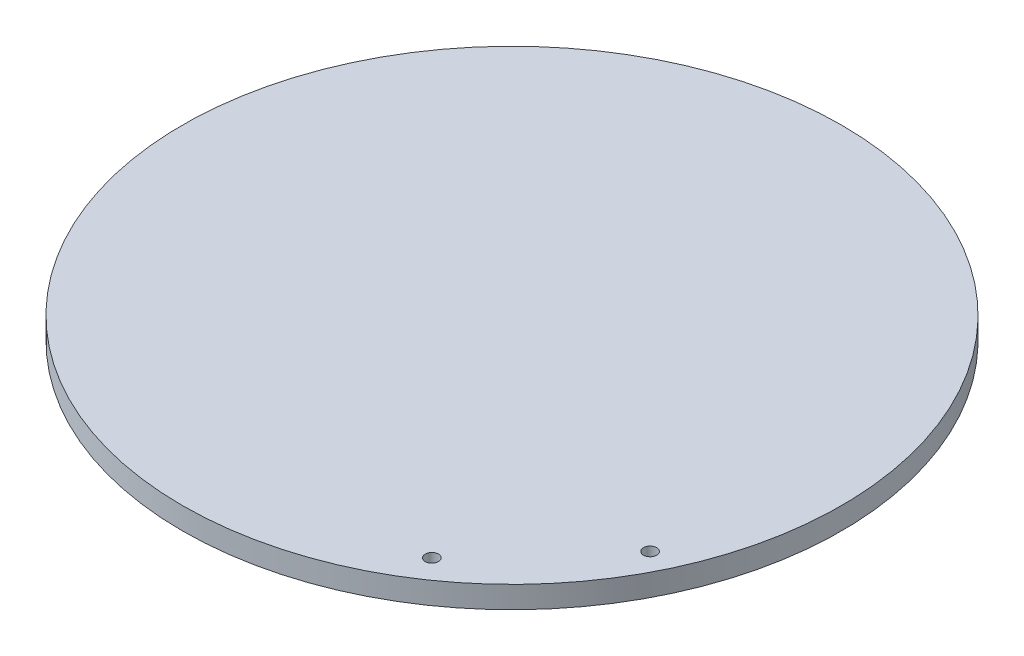
ISO-10303-21;
HEADER;
FILE_DESCRIPTION(('STEP AP214'),'2;1');
FILE_NAME('part.step','',(''),(''),'','','');
FILE_SCHEMA(('AUTOMOTIVE_DESIGN { 1 0 10303 214 1 1 1 1 }'));
ENDSEC;
DATA;
#1=APPLICATION_CONTEXT('core data for automotive mechanical design processes');
#2=APPLICATION_PROTOCOL_DEFINITION('international standard','automotive_design',2000,#1);
#3=PRODUCT_CONTEXT('',#1,'mechanical');
#4=PRODUCT('Part','Part','',(#3));
#5=PRODUCT_RELATED_PRODUCT_CATEGORY('part','',(#4));
#6=PRODUCT_DEFINITION_FORMATION('','',#4);
#7=PRODUCT_DEFINITION_CONTEXT('part definition',#1,'design');
#8=PRODUCT_DEFINITION('design','',#6,#7);
#9=PRODUCT_DEFINITION_SHAPE('','',#8);
#10=(LENGTH_UNIT() NAMED_UNIT(*) SI_UNIT(.MILLI.,.METRE.));
#11=(NAMED_UNIT(*) PLANE_ANGLE_UNIT() SI_UNIT($,.RADIAN.));
#12=(NAMED_UNIT(*) SI_UNIT($,.STERADIAN.) SOLID_ANGLE_UNIT());
#13=UNCERTAINTY_MEASURE_WITH_UNIT(LENGTH_MEASURE(1.E-05),#10,'distance_accuracy_value','');
#14=(GEOMETRIC_REPRESENTATION_CONTEXT(3) GLOBAL_UNCERTAINTY_ASSIGNED_CONTEXT((#13)) GLOBAL_UNIT_ASSIGNED_CONTEXT((#10,
#11,#12)) REPRESENTATION_CONTEXT('',''));
#15=CARTESIAN_POINT('',(0.,0.,0.));
#16=DIRECTION('',(0.,0.,1.));
#17=DIRECTION('',(1.,0.,0.));
#18=AXIS2_PLACEMENT_3D('',#15,#16,#17);
#19=CARTESIAN_POINT('',(0.,10.,0.));
#20=DIRECTION('',(0.,-1.,0.));
#21=DIRECTION('',(0.,0.,-1.));
#22=AXIS2_PLACEMENT_3D('',#19,#20,#21);
#23=CYLINDRICAL_SURFACE('',#22,150.);
#24=CARTESIAN_POINT('',(0.,10.,0.));
#25=DIRECTION('',(0.,1.,0.));
#26=DIRECTION('',(0.,0.,1.));
#27=AXIS2_PLACEMENT_3D('',#24,#25,#26);
#28=CIRCLE('',#27,150.);
#29=CARTESIAN_POINT('',(0.,10.,150.));
#30=VERTEX_POINT('',#29);
#31=EDGE_CURVE('E10',#30,#30,#28,.T.);
#32=ORIENTED_EDGE('',*,*,#31,.F.);
#33=EDGE_LOOP('',(#32));
#34=FACE_BOUND('',#33,.T.);
#35=CARTESIAN_POINT('',(0.,0.,0.));
#36=DIRECTION('',(0.,1.,0.));
#37=DIRECTION('',(0.,0.,1.));
#38=AXIS2_PLACEMENT_3D('',#35,#36,#37);
#39=CIRCLE('',#38,150.);
#40=CARTESIAN_POINT('',(0.,0.,150.));
#41=VERTEX_POINT('',#40);
#42=EDGE_CURVE('E37',#41,#41,#39,.T.);
#43=ORIENTED_EDGE('',*,*,#42,.T.);
#44=EDGE_LOOP('',(#43));
#45=FACE_BOUND('',#44,.T.);
#46=ADVANCED_FACE('F40',(#34,#45),#23,.T.);
#47=CARTESIAN_POINT('',(0.,10.,0.));
#48=DIRECTION('',(0.,1.,0.));
#49=DIRECTION('',(0.,0.,1.));
#50=AXIS2_PLACEMENT_3D('',#47,#48,#49);
#51=PLANE('',#50);
#52=CARTESIAN_POINT('',(77.3593917229983,10.,113.828819249555));
#53=DIRECTION('',(0.,1.,0.));
#54=DIRECTION('',(0.,0.,1.));
#55=AXIS2_PLACEMENT_3D('',#52,#53,#54);
#56=CIRCLE('',#55,3.00000000000001);
#57=CARTESIAN_POINT('',(77.3593917229983,10.,116.828819249555));
#58=VERTEX_POINT('',#57);
#59=EDGE_CURVE('E54',#58,#58,#56,.T.);
#60=ORIENTED_EDGE('',*,*,#59,.F.);
#61=EDGE_LOOP('',(#60));
#62=FACE_BOUND('',#61,.T.);
#63=CARTESIAN_POINT('',(124.487218520783,10.,61.6515824377221));
#64=DIRECTION('',(0.,1.,0.));
#65=DIRECTION('',(0.,0.,1.));
#66=AXIS2_PLACEMENT_3D('',#63,#64,#65);
#67=CIRCLE('',#66,2.99999999999999);
#68=CARTESIAN_POINT('',(124.487218520783,10.,64.6515824377221));
#69=VERTEX_POINT('',#68);
#70=EDGE_CURVE('E55',#69,#69,#67,.T.);
#71=ORIENTED_EDGE('',*,*,#70,.F.);
#72=EDGE_LOOP('',(#71));
#73=FACE_BOUND('',#72,.T.);
#74=ORIENTED_EDGE('',*,*,#31,.T.);
#75=EDGE_LOOP('',(#74));
#76=FACE_BOUND('',#75,.T.);
#77=ADVANCED_FACE('F72',(#62,#73,#76),#51,.T.);
#78=CARTESIAN_POINT('',(0.,0.,0.));
#79=DIRECTION('',(0.,1.,0.));
#80=DIRECTION('',(0.,0.,1.));
#81=AXIS2_PLACEMENT_3D('',#78,#79,#80);
#82=PLANE('',#81);
#83=CARTESIAN_POINT('',(77.3593917229983,0.,113.828819249555));
#84=DIRECTION('',(0.,1.,0.));
#85=DIRECTION('',(0.,0.,1.));
#86=AXIS2_PLACEMENT_3D('',#83,#84,#85);
#87=CIRCLE('',#86,3.00000000000001);
#88=CARTESIAN_POINT('',(77.3593917229983,0.,116.828819249555));
#89=VERTEX_POINT('',#88);
#90=EDGE_CURVE('E50',#89,#89,#87,.T.);
#91=ORIENTED_EDGE('',*,*,#90,.T.);
#92=EDGE_LOOP('',(#91));
#93=FACE_BOUND('',#92,.T.);
#94=CARTESIAN_POINT('',(124.487218520783,0.,61.6515824377221));
#95=DIRECTION('',(0.,1.,0.));
#96=DIRECTION('',(0.,0.,1.));
#97=AXIS2_PLACEMENT_3D('',#94,#95,#96);
#98=CIRCLE('',#97,2.99999999999999);
#99=CARTESIAN_POINT('',(124.487218520783,0.,64.6515824377221));
#100=VERTEX_POINT('',#99);
#101=EDGE_CURVE('E47',#100,#100,#98,.T.);
#102=ORIENTED_EDGE('',*,*,#101,.T.);
#103=EDGE_LOOP('',(#102));
#104=FACE_BOUND('',#103,.T.);
#105=ORIENTED_EDGE('',*,*,#42,.F.);
#106=EDGE_LOOP('',(#105));
#107=FACE_BOUND('',#106,.T.);
#108=ADVANCED_FACE('F62',(#93,#104,#107),#82,.F.);
#109=CARTESIAN_POINT('',(124.487218520783,0.,61.6515824377221));
#110=DIRECTION('',(0.,1.,0.));
#111=DIRECTION('',(0.,0.,1.));
#112=AXIS2_PLACEMENT_3D('',#109,#110,#111);
#113=CYLINDRICAL_SURFACE('',#112,2.99999999999999);
#114=ORIENTED_EDGE('',*,*,#101,.F.);
#115=EDGE_LOOP('',(#114));
#116=FACE_BOUND('',#115,.T.);
#117=ORIENTED_EDGE('',*,*,#70,.T.);
#118=EDGE_LOOP('',(#117));
#119=FACE_BOUND('',#118,.T.);
#120=ADVANCED_FACE('F70',(#116,#119),#113,.F.);
#121=CARTESIAN_POINT('',(77.3593917229983,0.,113.828819249555));
#122=DIRECTION('',(0.,1.,0.));
#123=DIRECTION('',(0.,0.,1.));
#124=AXIS2_PLACEMENT_3D('',#121,#122,#123);
#125=CYLINDRICAL_SURFACE('',#124,3.00000000000001);
#126=ORIENTED_EDGE('',*,*,#90,.F.);
#127=EDGE_LOOP('',(#126));
#128=FACE_BOUND('',#127,.T.);
#129=ORIENTED_EDGE('',*,*,#59,.T.);
#130=EDGE_LOOP('',(#129));
#131=FACE_BOUND('',#130,.T.);
#132=ADVANCED_FACE('F61',(#128,#131),#125,.F.);
#133=CLOSED_SHELL('',(#46,#77,#108,#120,#132));
#134=MANIFOLD_SOLID_BREP('B2',#133);
#135=ADVANCED_BREP_SHAPE_REPRESENTATION('',(#18,#134),#14);
#136=SHAPE_DEFINITION_REPRESENTATION(#9,#135);
ENDSEC;
END-ISO-10303-21;
